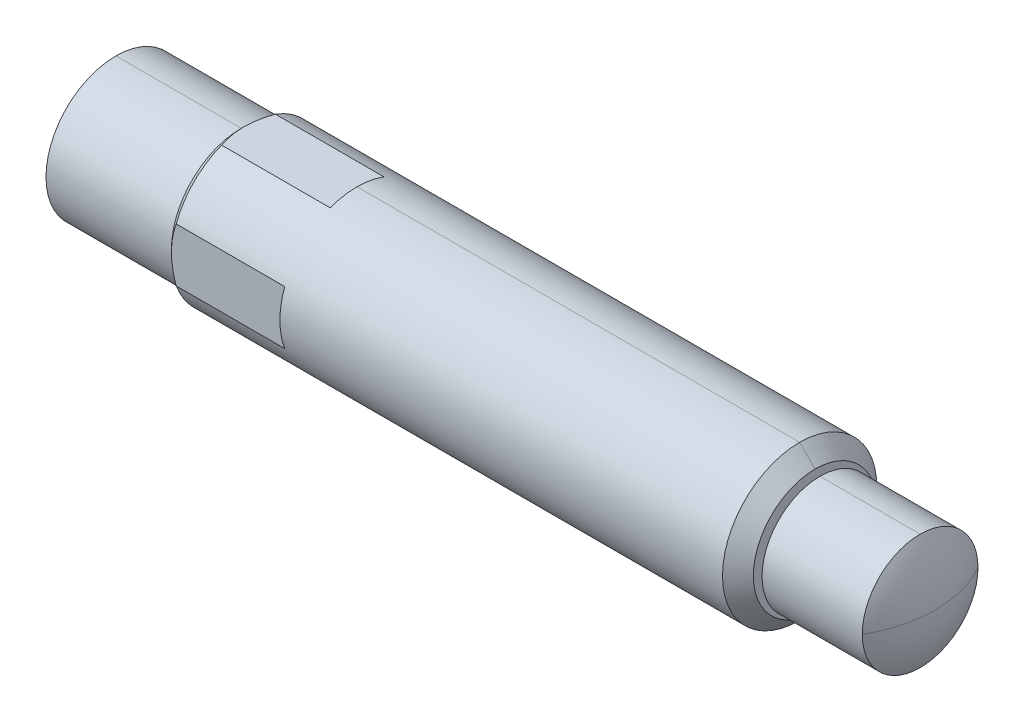
ISO-10303-21;
HEADER;
FILE_DESCRIPTION(('STEP AP214'),'2;1');
FILE_NAME('part.step','',(''),(''),'','','');
FILE_SCHEMA(('AUTOMOTIVE_DESIGN { 1 0 10303 214 1 1 1 1 }'));
ENDSEC;
DATA;
#1=APPLICATION_CONTEXT('core data for automotive mechanical design processes');
#2=APPLICATION_PROTOCOL_DEFINITION('international standard','automotive_design',2000,#1);
#3=PRODUCT_CONTEXT('',#1,'mechanical');
#4=PRODUCT('Part','Part','',(#3));
#5=PRODUCT_RELATED_PRODUCT_CATEGORY('part','',(#4));
#6=PRODUCT_DEFINITION_FORMATION('','',#4);
#7=PRODUCT_DEFINITION_CONTEXT('part definition',#1,'design');
#8=PRODUCT_DEFINITION('design','',#6,#7);
#9=PRODUCT_DEFINITION_SHAPE('','',#8);
#10=(LENGTH_UNIT() NAMED_UNIT(*) SI_UNIT(.MILLI.,.METRE.));
#11=(NAMED_UNIT(*) PLANE_ANGLE_UNIT() SI_UNIT($,.RADIAN.));
#12=(NAMED_UNIT(*) SI_UNIT($,.STERADIAN.) SOLID_ANGLE_UNIT());
#13=UNCERTAINTY_MEASURE_WITH_UNIT(LENGTH_MEASURE(1.E-05),#10,'distance_accuracy_value','');
#14=(GEOMETRIC_REPRESENTATION_CONTEXT(3) GLOBAL_UNCERTAINTY_ASSIGNED_CONTEXT((#13)) GLOBAL_UNIT_ASSIGNED_CONTEXT((#10,
#11,#12)) REPRESENTATION_CONTEXT('',''));
#15=CARTESIAN_POINT('',(0.,0.,0.));
#16=DIRECTION('',(0.,0.,1.));
#17=DIRECTION('',(1.,0.,0.));
#18=AXIS2_PLACEMENT_3D('',#15,#16,#17);
#19=CARTESIAN_POINT('',(0.499999999999972,0.,0.));
#20=DIRECTION('',(1.,0.,0.));
#21=DIRECTION('',(0.,1.,0.));
#22=AXIS2_PLACEMENT_3D('',#19,#20,#21);
#23=SPHERICAL_SURFACE('',#22,12.);
#24=CARTESIAN_POINT('',(10.8923048454133,0.,0.));
#25=DIRECTION('',(1.,0.,0.));
#26=DIRECTION('',(0.,0.,-1.));
#27=AXIS2_PLACEMENT_3D('',#24,#25,#26);
#28=CIRCLE('',#27,6.);
#29=CARTESIAN_POINT('',(10.8923048454133,-6.,0.));
#30=VERTEX_POINT('',#29);
#31=CARTESIAN_POINT('',(10.8923048454133,-5.61562311950955E-12,5.99999999999997));
#32=VERTEX_POINT('',#31);
#33=EDGE_CURVE('E158',#30,#32,#28,.F.);
#34=ORIENTED_EDGE('',*,*,#33,.F.);
#35=CARTESIAN_POINT('',(10.8923048454133,0.,0.));
#36=DIRECTION('',(1.,0.,0.));
#37=DIRECTION('',(0.,0.,-1.));
#38=AXIS2_PLACEMENT_3D('',#35,#36,#37);
#39=CIRCLE('',#38,6.);
#40=CARTESIAN_POINT('',(10.8923048454133,-2.80916782890994E-12,-5.99999999999999));
#41=VERTEX_POINT('',#40);
#42=EDGE_CURVE('E154',#41,#30,#39,.F.);
#43=ORIENTED_EDGE('',*,*,#42,.F.);
#44=CARTESIAN_POINT('',(12.5,0.,0.));
#45=CARTESIAN_POINT('',(12.5000008232801,-2.45104987914039E-13,-0.130899720016836));
#46=CARTESIAN_POINT('',(12.4978581882124,-4.90209888419239E-13,-0.261799393352483));
#47=CARTESIAN_POINT('',(12.4892919112204,-9.80157271765673E-13,-0.52345859437014));
#48=CARTESIAN_POINT('',(12.4828682692961,-1.22499975460691E-12,-0.65421812205215));
#49=CARTESIAN_POINT('',(12.4657458884303,-1.71416005977911E-12,-0.915456979471276));
#50=CARTESIAN_POINT('',(12.4550471494888,-1.95847788211008E-12,-1.04593630920839));
#51=CARTESIAN_POINT('',(12.4293862906439,-2.44632726052987E-12,-1.30647505870105));
#52=CARTESIAN_POINT('',(12.4144241707406,-2.68985881661868E-12,-1.4365344784566));
#53=CARTESIAN_POINT('',(12.3802525022308,-3.17587487860013E-12,-1.69609413482463));
#54=CARTESIAN_POINT('',(12.3610429536244,-3.41835938449278E-12,-1.82559437143711));
#55=CARTESIAN_POINT('',(12.3183970164127,-3.90202168874345E-12,-2.083896990033));
#56=CARTESIAN_POINT('',(12.2949606278074,-4.14319948710147E-12,-2.21269937201641));
#57=CARTESIAN_POINT('',(12.2438861018701,-4.62399011674339E-12,-2.46946835637065));
#58=CARTESIAN_POINT('',(12.2162479645381,-4.86360294802727E-12,-2.59743495874147));
#59=CARTESIAN_POINT('',(12.1567995381179,-5.34100706020427E-12,-2.85239535408346));
#60=CARTESIAN_POINT('',(12.1249892490296,-5.57879834109739E-12,-2.97938914705462));
#61=CARTESIAN_POINT('',(12.057230581908,-6.05230471952642E-12,-3.23226793540585));
#62=CARTESIAN_POINT('',(12.0212822038745,-6.28801981706234E-12,-3.35815293078593));
#63=CARTESIAN_POINT('',(11.9452858536985,-6.75712141946905E-12,-3.60867932332113));
#64=CARTESIAN_POINT('',(11.9052378815558,-6.99050792433984E-12,-3.73332072047625));
#65=CARTESIAN_POINT('',(11.8210852263267,-7.4547024241179E-12,-3.98122644679959));
#66=CARTESIAN_POINT('',(11.7769805432401,-7.68551041902516E-12,-4.10449077596781));
#67=CARTESIAN_POINT('',(11.6847616989357,-8.14430074830473E-12,-4.34951037414175));
#68=CARTESIAN_POINT('',(11.6366475377179,-8.37228308267703E-12,-4.47126564314748));
#69=CARTESIAN_POINT('',(11.536461242553,-8.82517794523351E-12,-4.71313673361463));
#70=CARTESIAN_POINT('',(11.484389108606,-9.05009047341769E-12,-4.83325255507606));
#71=CARTESIAN_POINT('',(11.3763426895022,-9.49660494305538E-12,-5.07171616022937));
#72=CARTESIAN_POINT('',(11.3203684043455,-9.71820688450889E-12,-5.19006394392125));
#73=CARTESIAN_POINT('',(11.204577392439,-1.01578626545307E-11,-5.42486462133473));
#74=CARTESIAN_POINT('',(11.1447606656892,-1.0375916483099E-11,-5.54131751505633));
#75=CARTESIAN_POINT('',(11.0213496786713,-1.08082433854034E-11,-5.77220416876756));
#76=CARTESIAN_POINT('',(10.9577554184032,-1.10225164591396E-11,-5.88663792875718));
#77=CARTESIAN_POINT('',(10.8923048454133,-1.12347828344864E-11,-5.99999999999997));
#78=B_SPLINE_CURVE_WITH_KNOTS('',3,(#44,#45,#46,#47,#48,#49,#50,#51,#52,#53,#54,#55,#56,#57,#58,
#59,#60,#61,#62,#63,#64,#65,#66,#67,#68,#69,#70,#71,#72,#73,#74,#75,#76,#77),.UNSPECIFIED.,.F.,
.F.,(4,2,2,2,2,2,2,2,2,2,2,2,2,2,2,2,4),(0.,0.392681559035681,0.785363118071362,
1.17804467710704,1.57072623614272,1.9634077951784,2.35608935421409,2.74877091324977,
3.14145247228545,3.53413403132113,3.92681559035681,4.31949714939249,4.71217870842817,
5.10486026746385,5.49754182649953,5.89022338553521,6.28290494457089),.UNSPECIFIED.);
#79=CARTESIAN_POINT('',(12.5,0.,0.));
#80=VERTEX_POINT('',#79);
#81=EDGE_CURVE('E176',#80,#41,#78,.T.);
#82=ORIENTED_EDGE('',*,*,#81,.F.);
#83=CARTESIAN_POINT('',(0.499999999999972,0.,0.));
#84=DIRECTION('',(0.,-1.,-1.87199683380525E-12));
#85=DIRECTION('',(1.,0.,0.));
#86=AXIS2_PLACEMENT_3D('',#83,#84,#85);
#87=CIRCLE('',#86,12.);
#88=EDGE_CURVE('E174',#32,#80,#87,.F.);
#89=ORIENTED_EDGE('',*,*,#88,.F.);
#90=EDGE_LOOP('',(#34,#43,#82,#89));
#91=FACE_BOUND('',#90,.T.);
#92=ADVANCED_FACE('F14',(#91),#23,.T.);
#93=CARTESIAN_POINT('',(0.499999999999972,0.,0.));
#94=DIRECTION('',(1.,0.,0.));
#95=DIRECTION('',(0.,1.,0.));
#96=AXIS2_PLACEMENT_3D('',#93,#94,#95);
#97=SPHERICAL_SURFACE('',#96,12.);
#98=CARTESIAN_POINT('',(10.8923048454133,0.,0.));
#99=DIRECTION('',(1.,0.,0.));
#100=DIRECTION('',(0.,0.,-1.));
#101=AXIS2_PLACEMENT_3D('',#98,#99,#100);
#102=CIRCLE('',#101,6.);
#103=CARTESIAN_POINT('',(10.8923048454133,6.,0.));
#104=VERTEX_POINT('',#103);
#105=EDGE_CURVE('E180',#104,#41,#102,.F.);
#106=ORIENTED_EDGE('',*,*,#105,.F.);
#107=CARTESIAN_POINT('',(10.8923048454133,0.,0.));
#108=DIRECTION('',(1.,0.,0.));
#109=DIRECTION('',(0.,0.,-1.));
#110=AXIS2_PLACEMENT_3D('',#107,#108,#109);
#111=CIRCLE('',#110,6.);
#112=EDGE_CURVE('E170',#32,#104,#111,.F.);
#113=ORIENTED_EDGE('',*,*,#112,.F.);
#114=ORIENTED_EDGE('',*,*,#88,.T.);
#115=ORIENTED_EDGE('',*,*,#81,.T.);
#116=EDGE_LOOP('',(#106,#113,#114,#115));
#117=FACE_BOUND('',#116,.T.);
#118=ADVANCED_FACE('F194',(#117),#97,.T.);
#119=CARTESIAN_POINT('',(5.69615242270663,0.,0.));
#120=DIRECTION('',(1.,0.,0.));
#121=DIRECTION('',(0.,0.,-1.));
#122=AXIS2_PLACEMENT_3D('',#119,#120,#121);
#123=CYLINDRICAL_SURFACE('',#122,6.);
#124=DIRECTION('',(1.,0.,0.));
#125=VECTOR('',#124,1.);
#126=CARTESIAN_POINT('',(5.69615242270663,-6.,0.));
#127=LINE('',#126,#125);
#128=CARTESIAN_POINT('',(0.5,-6.,0.));
#129=VERTEX_POINT('',#128);
#130=EDGE_CURVE('E145',#129,#30,#127,.T.);
#131=ORIENTED_EDGE('',*,*,#130,.F.);
#132=CARTESIAN_POINT('',(0.5,0.,0.));
#133=DIRECTION('',(1.,0.,0.));
#134=DIRECTION('',(0.,0.,-1.));
#135=AXIS2_PLACEMENT_3D('',#132,#133,#134);
#136=CIRCLE('',#135,6.);
#137=CARTESIAN_POINT('',(0.5,6.,0.));
#138=VERTEX_POINT('',#137);
#139=EDGE_CURVE('E150',#138,#129,#136,.F.);
#140=ORIENTED_EDGE('',*,*,#139,.F.);
#141=DIRECTION('',(1.,0.,0.));
#142=VECTOR('',#141,1.);
#143=CARTESIAN_POINT('',(5.69615242270663,6.,0.));
#144=LINE('',#143,#142);
#145=EDGE_CURVE('E159',#104,#138,#144,.F.);
#146=ORIENTED_EDGE('',*,*,#145,.F.);
#147=ORIENTED_EDGE('',*,*,#105,.T.);
#148=ORIENTED_EDGE('',*,*,#42,.T.);
#149=EDGE_LOOP('',(#131,#140,#146,#147,#148));
#150=FACE_BOUND('',#149,.T.);
#151=ADVANCED_FACE('F147',(#150),#123,.T.);
#152=CARTESIAN_POINT('',(5.69615242270663,0.,0.));
#153=DIRECTION('',(1.,0.,0.));
#154=DIRECTION('',(0.,0.,-1.));
#155=AXIS2_PLACEMENT_3D('',#152,#153,#154);
#156=CYLINDRICAL_SURFACE('',#155,6.);
#157=ORIENTED_EDGE('',*,*,#33,.T.);
#158=ORIENTED_EDGE('',*,*,#112,.T.);
#159=ORIENTED_EDGE('',*,*,#145,.T.);
#160=CARTESIAN_POINT('',(0.5,0.,0.));
#161=DIRECTION('',(1.,0.,0.));
#162=DIRECTION('',(0.,0.,-1.));
#163=AXIS2_PLACEMENT_3D('',#160,#161,#162);
#164=CIRCLE('',#163,6.);
#165=EDGE_CURVE('E162',#129,#138,#164,.F.);
#166=ORIENTED_EDGE('',*,*,#165,.F.);
#167=ORIENTED_EDGE('',*,*,#130,.T.);
#168=EDGE_LOOP('',(#157,#158,#159,#166,#167));
#169=FACE_BOUND('',#168,.T.);
#170=ADVANCED_FACE('F163',(#169),#156,.T.);
#171=CARTESIAN_POINT('',(0.5,4.5,0.));
#172=DIRECTION('',(-1.,0.,0.));
#173=DIRECTION('',(0.,0.,1.));
#174=AXIS2_PLACEMENT_3D('',#171,#172,#173);
#175=PLANE('',#174);
#176=ORIENTED_EDGE('',*,*,#139,.T.);
#177=ORIENTED_EDGE('',*,*,#165,.T.);
#178=EDGE_LOOP('',(#176,#177));
#179=FACE_BOUND('',#178,.T.);
#180=CARTESIAN_POINT('',(0.5,0.,0.));
#181=DIRECTION('',(1.,0.,0.));
#182=DIRECTION('',(0.,0.,-1.));
#183=AXIS2_PLACEMENT_3D('',#180,#181,#182);
#184=CIRCLE('',#183,3.);
#185=CARTESIAN_POINT('',(0.5,3.,0.));
#186=VERTEX_POINT('',#185);
#187=CARTESIAN_POINT('',(0.5,-3.,0.));
#188=VERTEX_POINT('',#187);
#189=EDGE_CURVE('E235',#186,#188,#184,.F.);
#190=ORIENTED_EDGE('',*,*,#189,.F.);
#191=CARTESIAN_POINT('',(0.5,0.,0.));
#192=DIRECTION('',(1.,0.,0.));
#193=DIRECTION('',(0.,0.,-1.));
#194=AXIS2_PLACEMENT_3D('',#191,#192,#193);
#195=CIRCLE('',#194,3.);
#196=EDGE_CURVE('E231',#188,#186,#195,.F.);
#197=ORIENTED_EDGE('',*,*,#196,.F.);
#198=EDGE_LOOP('',(#190,#197));
#199=FACE_BOUND('',#198,.T.);
#200=ADVANCED_FACE('F168',(#179,#199),#175,.T.);
#201=CARTESIAN_POINT('',(-72.5,3.625,0.));
#202=DIRECTION('',(-1.,0.,0.));
#203=DIRECTION('',(0.,0.,1.));
#204=AXIS2_PLACEMENT_3D('',#201,#202,#203);
#205=PLANE('',#204);
#206=CARTESIAN_POINT('',(-72.5,0.,0.));
#207=DIRECTION('',(1.,0.,0.));
#208=DIRECTION('',(0.,0.,-1.));
#209=AXIS2_PLACEMENT_3D('',#206,#207,#208);
#210=CIRCLE('',#209,7.25);
#211=CARTESIAN_POINT('',(-72.5,-7.25,0.));
#212=VERTEX_POINT('',#211);
#213=CARTESIAN_POINT('',(-72.5,7.25,0.));
#214=VERTEX_POINT('',#213);
#215=EDGE_CURVE('E166',#212,#214,#210,.T.);
#216=ORIENTED_EDGE('',*,*,#215,.F.);
#217=CARTESIAN_POINT('',(-72.5,0.,0.));
#218=DIRECTION('',(1.,0.,0.));
#219=DIRECTION('',(0.,0.,-1.));
#220=AXIS2_PLACEMENT_3D('',#217,#218,#219);
#221=CIRCLE('',#220,7.25);
#222=EDGE_CURVE('E241',#214,#212,#221,.T.);
#223=ORIENTED_EDGE('',*,*,#222,.F.);
#224=EDGE_LOOP('',(#216,#223));
#225=FACE_BOUND('',#224,.T.);
#226=ADVANCED_FACE('F425',(#225),#205,.T.);
#227=CARTESIAN_POINT('',(-66.,0.,0.));
#228=DIRECTION('',(1.,0.,0.));
#229=DIRECTION('',(0.,0.,-1.));
#230=AXIS2_PLACEMENT_3D('',#227,#228,#229);
#231=CYLINDRICAL_SURFACE('',#230,7.25);
#232=DIRECTION('',(1.,0.,0.));
#233=VECTOR('',#232,1.);
#234=CARTESIAN_POINT('',(-66.,-7.25,0.));
#235=LINE('',#234,#233);
#236=CARTESIAN_POINT('',(-59.5,-7.25,0.));
#237=VERTEX_POINT('',#236);
#238=EDGE_CURVE('E244',#212,#237,#235,.T.);
#239=ORIENTED_EDGE('',*,*,#238,.F.);
#240=ORIENTED_EDGE('',*,*,#215,.T.);
#241=DIRECTION('',(1.,0.,0.));
#242=VECTOR('',#241,1.);
#243=CARTESIAN_POINT('',(-66.,7.25,0.));
#244=LINE('',#243,#242);
#245=CARTESIAN_POINT('',(-59.5,7.25,0.));
#246=VERTEX_POINT('',#245);
#247=EDGE_CURVE('E238',#246,#214,#244,.F.);
#248=ORIENTED_EDGE('',*,*,#247,.F.);
#249=CARTESIAN_POINT('',(-59.5,0.,0.));
#250=DIRECTION('',(1.,0.,0.));
#251=DIRECTION('',(0.,1.,0.));
#252=AXIS2_PLACEMENT_3D('',#249,#250,#251);
#253=CIRCLE('',#252,7.25);
#254=EDGE_CURVE('E257',#237,#246,#253,.T.);
#255=ORIENTED_EDGE('',*,*,#254,.F.);
#256=EDGE_LOOP('',(#239,#240,#248,#255));
#257=FACE_BOUND('',#256,.T.);
#258=ADVANCED_FACE('F423',(#257),#231,.T.);
#259=CARTESIAN_POINT('',(0.25,0.,0.));
#260=DIRECTION('',(1.,0.,0.));
#261=DIRECTION('',(0.,0.,-1.));
#262=AXIS2_PLACEMENT_3D('',#259,#260,#261);
#263=CYLINDRICAL_SURFACE('',#262,3.);
#264=DIRECTION('',(1.,0.,0.));
#265=VECTOR('',#264,1.);
#266=CARTESIAN_POINT('',(0.25,-3.,0.));
#267=LINE('',#266,#265);
#268=CARTESIAN_POINT('',(0.,-3.,0.));
#269=VERTEX_POINT('',#268);
#270=EDGE_CURVE('E227',#269,#188,#267,.T.);
#271=ORIENTED_EDGE('',*,*,#270,.F.);
#272=CARTESIAN_POINT('',(0.,0.,0.));
#273=DIRECTION('',(1.,0.,0.));
#274=DIRECTION('',(0.,0.,-1.));
#275=AXIS2_PLACEMENT_3D('',#272,#273,#274);
#276=CIRCLE('',#275,3.);
#277=CARTESIAN_POINT('',(0.,3.,0.));
#278=VERTEX_POINT('',#277);
#279=EDGE_CURVE('E495',#278,#269,#276,.F.);
#280=ORIENTED_EDGE('',*,*,#279,.F.);
#281=DIRECTION('',(1.,0.,0.));
#282=VECTOR('',#281,1.);
#283=CARTESIAN_POINT('',(0.25,3.,0.));
#284=LINE('',#283,#282);
#285=EDGE_CURVE('E232',#186,#278,#284,.F.);
#286=ORIENTED_EDGE('',*,*,#285,.F.);
#287=ORIENTED_EDGE('',*,*,#189,.T.);
#288=EDGE_LOOP('',(#271,#280,#286,#287));
#289=FACE_BOUND('',#288,.T.);
#290=ADVANCED_FACE('F504',(#289),#263,.T.);
#291=CARTESIAN_POINT('',(0.25,0.,0.));
#292=DIRECTION('',(1.,0.,0.));
#293=DIRECTION('',(0.,0.,-1.));
#294=AXIS2_PLACEMENT_3D('',#291,#292,#293);
#295=CYLINDRICAL_SURFACE('',#294,3.);
#296=ORIENTED_EDGE('',*,*,#270,.T.);
#297=ORIENTED_EDGE('',*,*,#196,.T.);
#298=ORIENTED_EDGE('',*,*,#285,.T.);
#299=CARTESIAN_POINT('',(0.,0.,0.));
#300=DIRECTION('',(1.,0.,0.));
#301=DIRECTION('',(0.,0.,-1.));
#302=AXIS2_PLACEMENT_3D('',#299,#300,#301);
#303=CIRCLE('',#302,3.);
#304=EDGE_CURVE('E319',#269,#278,#303,.F.);
#305=ORIENTED_EDGE('',*,*,#304,.F.);
#306=EDGE_LOOP('',(#296,#297,#298,#305));
#307=FACE_BOUND('',#306,.T.);
#308=ADVANCED_FACE('F472',(#307),#295,.T.);
#309=CARTESIAN_POINT('',(-66.,0.,0.));
#310=DIRECTION('',(1.,0.,0.));
#311=DIRECTION('',(0.,0.,-1.));
#312=AXIS2_PLACEMENT_3D('',#309,#310,#311);
#313=CYLINDRICAL_SURFACE('',#312,7.25);
#314=ORIENTED_EDGE('',*,*,#238,.T.);
#315=CARTESIAN_POINT('',(-59.5,0.,0.));
#316=DIRECTION('',(1.,0.,0.));
#317=DIRECTION('',(0.,1.,0.));
#318=AXIS2_PLACEMENT_3D('',#315,#316,#317);
#319=CIRCLE('',#318,7.25);
#320=EDGE_CURVE('E250',#246,#237,#319,.T.);
#321=ORIENTED_EDGE('',*,*,#320,.F.);
#322=ORIENTED_EDGE('',*,*,#247,.T.);
#323=ORIENTED_EDGE('',*,*,#222,.T.);
#324=EDGE_LOOP('',(#314,#321,#322,#323));
#325=FACE_BOUND('',#324,.T.);
#326=ADVANCED_FACE('F428',(#325),#313,.T.);
#327=CARTESIAN_POINT('',(-47.5,0.,0.));
#328=DIRECTION('',(1.,0.,0.));
#329=DIRECTION('',(0.,0.,-1.));
#330=AXIS2_PLACEMENT_3D('',#327,#328,#329);
#331=PLANE('',#330);
#332=DIRECTION('',(0.,1.,0.));
#333=VECTOR('',#332,1.);
#334=CARTESIAN_POINT('',(-47.5,7.5,-7.5));
#335=LINE('',#334,#333);
#336=CARTESIAN_POINT('',(-47.5,-2.78388218141501,-7.5));
#337=VERTEX_POINT('',#336);
#338=CARTESIAN_POINT('',(-47.5,2.78388218141501,-7.5));
#339=VERTEX_POINT('',#338);
#340=EDGE_CURVE('E247',#337,#339,#335,.T.);
#341=ORIENTED_EDGE('',*,*,#340,.T.);
#342=CARTESIAN_POINT('',(-47.5,0.,0.));
#343=DIRECTION('',(1.,0.,0.));
#344=DIRECTION('',(0.,0.,-1.));
#345=AXIS2_PLACEMENT_3D('',#342,#343,#344);
#346=CIRCLE('',#345,8.);
#347=EDGE_CURVE('E282',#337,#339,#346,.T.);
#348=ORIENTED_EDGE('',*,*,#347,.F.);
#349=EDGE_LOOP('',(#341,#348));
#350=FACE_BOUND('',#349,.T.);
#351=ADVANCED_FACE('F465',(#350),#331,.F.);
#352=CARTESIAN_POINT('',(-47.5,7.5,-7.5));
#353=DIRECTION('',(0.,0.,1.));
#354=DIRECTION('',(1.,0.,0.));
#355=AXIS2_PLACEMENT_3D('',#352,#353,#354);
#356=PLANE('',#355);
#357=CARTESIAN_POINT('',(-58.75,2.78388218141501,-7.5));
#358=CARTESIAN_POINT('',(-58.7908343610241,2.6665325399711,-7.5));
#359=CARTESIAN_POINT('',(-58.8296450609404,2.54848292274457,-7.5));
#360=CARTESIAN_POINT('',(-58.9028438594073,2.31098265055368,-7.5));
#361=CARTESIAN_POINT('',(-58.9372305831194,2.19153157258164,-7.5));
#362=CARTESIAN_POINT('',(-59.0332630346701,1.83077940481886,-7.5));
#363=CARTESIAN_POINT('',(-59.0876406905147,1.58747536783262,-7.5));
#364=CARTESIAN_POINT('',(-59.1726854727309,1.10468346411936,-7.5));
#365=CARTESIAN_POINT('',(-59.2040501641788,0.8653194538993,-7.5));
#366=CARTESIAN_POINT('',(-59.2439382841863,0.384901302167785,-7.5));
#367=CARTESIAN_POINT('',(-59.2524857448856,0.143849207225305,-7.5));
#368=CARTESIAN_POINT('',(-59.2464610472351,-0.32227682020807,-7.5));
#369=CARTESIAN_POINT('',(-59.2333546401303,-0.547371523456219,-7.5));
#370=CARTESIAN_POINT('',(-59.1874824156523,-0.995727692119136,-7.5));
#371=CARTESIAN_POINT('',(-59.1546992438144,-1.21898736266478,-7.5));
#372=CARTESIAN_POINT('',(-59.0698469306853,-1.66883770237948,-7.5));
#373=CARTESIAN_POINT('',(-59.0172170392475,-1.89532047216224,-7.5));
#374=CARTESIAN_POINT('',(-58.895398818921,-2.34337550813609,-7.5));
#375=CARTESIAN_POINT('',(-58.8262406355852,-2.56495592093498,-7.5));
#376=CARTESIAN_POINT('',(-58.75,-2.78388218141501,-7.5));
#377=B_SPLINE_CURVE_WITH_KNOTS('',3,(#357,#358,#359,#360,#361,#362,#363,#364,#365,#366,#367,
#368,#369,#370,#371,#372,#373,#374,#375,#376),.UNSPECIFIED.,.F.,.F.,(4,2,2,2,2,2,2,2,2,4),(0.,
0.372720020709469,0.745555593197198,1.49248371390584,2.21571265277952,2.93817955310983,
3.61371600872445,4.28984914964184,4.98672269593563,5.68233480290052),.UNSPECIFIED.);
#378=CARTESIAN_POINT('',(-58.75,2.78388218141501,-7.5));
#379=VERTEX_POINT('',#378);
#380=CARTESIAN_POINT('',(-58.75,-2.78388218141501,-7.5));
#381=VERTEX_POINT('',#380);
#382=EDGE_CURVE('E261',#379,#381,#377,.T.);
#383=ORIENTED_EDGE('',*,*,#382,.F.);
#384=DIRECTION('',(1.,0.,0.));
#385=VECTOR('',#384,1.);
#386=CARTESIAN_POINT('',(-30.175,2.78388218141501,-7.5));
#387=LINE('',#386,#385);
#388=EDGE_CURVE('E284',#339,#379,#387,.F.);
#389=ORIENTED_EDGE('',*,*,#388,.F.);
#390=ORIENTED_EDGE('',*,*,#340,.F.);
#391=DIRECTION('',(1.,0.,0.));
#392=VECTOR('',#391,1.);
#393=CARTESIAN_POINT('',(-30.175,-2.78388218141501,-7.5));
#394=LINE('',#393,#392);
#395=EDGE_CURVE('E279',#381,#337,#394,.T.);
#396=ORIENTED_EDGE('',*,*,#395,.F.);
#397=EDGE_LOOP('',(#383,#389,#390,#396));
#398=FACE_BOUND('',#397,.T.);
#399=ADVANCED_FACE('F403',(#398),#356,.F.);
#400=CARTESIAN_POINT('',(-58.75,0.,0.));
#401=DIRECTION('',(1.,0.,0.));
#402=DIRECTION('',(0.,0.,-1.));
#403=AXIS2_PLACEMENT_3D('',#400,#401,#402);
#404=CONICAL_SURFACE('',#403,8.,0.785398163397448);
#405=DIRECTION('',(-0.707106781186548,0.707106781186548,0.));
#406=VECTOR('',#405,1.);
#407=CARTESIAN_POINT('',(-59.125,-7.625,0.));
#408=LINE('',#407,#406);
#409=CARTESIAN_POINT('',(-59.25,-7.5,0.));
#410=VERTEX_POINT('',#409);
#411=EDGE_CURVE('E253',#237,#410,#408,.F.);
#412=ORIENTED_EDGE('',*,*,#411,.F.);
#413=ORIENTED_EDGE('',*,*,#254,.T.);
#414=DIRECTION('',(-0.707106781186548,-0.707106781186548,0.));
#415=VECTOR('',#414,1.);
#416=CARTESIAN_POINT('',(-59.125,7.625,0.));
#417=LINE('',#416,#415);
#418=CARTESIAN_POINT('',(-59.25,7.5,0.));
#419=VERTEX_POINT('',#418);
#420=EDGE_CURVE('E254',#419,#246,#417,.T.);
#421=ORIENTED_EDGE('',*,*,#420,.F.);
#422=CARTESIAN_POINT('',(-59.25,7.5,0.));
#423=CARTESIAN_POINT('',(-59.2500151134973,7.5,-0.118906126701689));
#424=CARTESIAN_POINT('',(-59.24717265383,7.5,-0.237806754451902));
#425=CARTESIAN_POINT('',(-59.2358850873229,7.5,-0.475323545770295));
#426=CARTESIAN_POINT('',(-59.2274408742413,7.5,-0.593939751688444));
#427=CARTESIAN_POINT('',(-59.2051412959235,7.5,-0.829816038019026));
#428=CARTESIAN_POINT('',(-59.1913245868226,7.5,-0.947079778541001));
#429=CARTESIAN_POINT('',(-59.1584887421915,7.5,-1.18086668836219));
#430=CARTESIAN_POINT('',(-59.1394695468033,7.5,-1.29738984912476));
#431=CARTESIAN_POINT('',(-59.0750146702574,7.5,-1.64537755437254));
#432=CARTESIAN_POINT('',(-59.0221571948173,7.5,-1.87550968066489));
#433=CARTESIAN_POINT('',(-58.9297091014408,7.5,-2.21792547883431));
#434=CARTESIAN_POINT('',(-58.8965514582847,7.5,-2.33201886163555));
#435=CARTESIAN_POINT('',(-58.8262112413854,7.5,-2.55891324258524));
#436=CARTESIAN_POINT('',(-58.7890301792891,7.5,-2.67171470862875));
#437=CARTESIAN_POINT('',(-58.75,7.5,-2.78388218141501));
#438=B_SPLINE_CURVE_WITH_KNOTS('',3,(#422,#423,#424,#425,#426,#427,#428,#429,#430,#431,#432,
#433,#434,#435,#436,#437),.UNSPECIFIED.,.F.,.F.,(4,2,2,2,2,2,2,4),(0.,0.356675243165351,
0.713293592586999,1.06739212005566,1.42149472183134,2.1289507330168,2.48533609962451,
2.84158802983759),.UNSPECIFIED.);
#439=CARTESIAN_POINT('',(-58.75,7.5,-2.78388218141501));
#440=VERTEX_POINT('',#439);
#441=EDGE_CURVE('E318',#419,#440,#438,.T.);
#442=ORIENTED_EDGE('',*,*,#441,.T.);
#443=CARTESIAN_POINT('',(-58.75,0.,0.));
#444=DIRECTION('',(1.,0.,0.));
#445=DIRECTION('',(0.,0.,-1.));
#446=AXIS2_PLACEMENT_3D('',#443,#444,#445);
#447=CIRCLE('',#446,8.);
#448=EDGE_CURVE('E287',#379,#440,#447,.T.);
#449=ORIENTED_EDGE('',*,*,#448,.F.);
#450=ORIENTED_EDGE('',*,*,#382,.T.);
#451=CARTESIAN_POINT('',(-58.75,0.,0.));
#452=DIRECTION('',(1.,0.,0.));
#453=DIRECTION('',(0.,0.,-1.));
#454=AXIS2_PLACEMENT_3D('',#451,#452,#453);
#455=CIRCLE('',#454,8.);
#456=CARTESIAN_POINT('',(-58.75,-7.5,-2.78388218141501));
#457=VERTEX_POINT('',#456);
#458=EDGE_CURVE('E275',#457,#381,#455,.T.);
#459=ORIENTED_EDGE('',*,*,#458,.F.);
#460=CARTESIAN_POINT('',(-58.75,-7.5,-2.78388218141501));
#461=CARTESIAN_POINT('',(-58.7890301792891,-7.5,-2.67171470862875));
#462=CARTESIAN_POINT('',(-58.8262112413855,-7.5,-2.55891324258524));
#463=CARTESIAN_POINT('',(-58.8965514582847,-7.5,-2.33201886163555));
#464=CARTESIAN_POINT('',(-58.9297091014408,-7.5,-2.21792547883431));
#465=CARTESIAN_POINT('',(-59.0221571948173,-7.5,-1.87550968066489));
#466=CARTESIAN_POINT('',(-59.0750146702574,-7.5,-1.64537755437254));
#467=CARTESIAN_POINT('',(-59.1394695468033,-7.5,-1.29738984912476));
#468=CARTESIAN_POINT('',(-59.1584887421915,-7.5,-1.18086668836219));
#469=CARTESIAN_POINT('',(-59.1913245868226,-7.5,-0.947079778541001));
#470=CARTESIAN_POINT('',(-59.2051412959235,-7.5,-0.829816038019026));
#471=CARTESIAN_POINT('',(-59.2274408742413,-7.5,-0.593939751688444));
#472=CARTESIAN_POINT('',(-59.2358850873229,-7.5,-0.475323545770295));
#473=CARTESIAN_POINT('',(-59.24717265383,-7.5,-0.237806754451902));
#474=CARTESIAN_POINT('',(-59.2500151134973,-7.5,-0.118906126701688));
#475=CARTESIAN_POINT('',(-59.25,-7.5,0.));
#476=B_SPLINE_CURVE_WITH_KNOTS('',3,(#460,#461,#462,#463,#464,#465,#466,#467,#468,#469,#470,
#471,#472,#473,#474,#475),.UNSPECIFIED.,.F.,.F.,(4,2,2,2,2,2,2,4),(0.,0.356251930213089,
0.712637296820797,1.42009330800625,1.77419590978193,2.12829443725059,2.48491278667224,
2.84158802983759),.UNSPECIFIED.);
#477=EDGE_CURVE('E349',#457,#410,#476,.T.);
#478=ORIENTED_EDGE('',*,*,#477,.T.);
#479=EDGE_LOOP('',(#412,#413,#421,#442,#449,#450,#459,#478));
#480=FACE_BOUND('',#479,.T.);
#481=ADVANCED_FACE('F397',(#480),#404,.T.);
#482=CARTESIAN_POINT('',(-1.59999999999999,0.,0.));
#483=DIRECTION('',(-1.,0.,0.));
#484=DIRECTION('',(0.,0.,1.));
#485=AXIS2_PLACEMENT_3D('',#482,#483,#484);
#486=CONICAL_SURFACE('',#485,8.,0.78539816339745);
#487=DIRECTION('',(0.707106781186546,0.707106781186549,0.));
#488=VECTOR('',#487,1.);
#489=CARTESIAN_POINT('',(-0.799999999999997,-7.2,0.));
#490=LINE('',#489,#488);
#491=CARTESIAN_POINT('',(-1.59999999999999,-8.,0.));
#492=VERTEX_POINT('',#491);
#493=CARTESIAN_POINT('',(0.,-6.4,0.));
#494=VERTEX_POINT('',#493);
#495=EDGE_CURVE('E34',#492,#494,#490,.T.);
#496=ORIENTED_EDGE('',*,*,#495,.F.);
#497=CARTESIAN_POINT('',(-1.59999999999999,0.,0.));
#498=DIRECTION('',(1.,0.,0.));
#499=DIRECTION('',(0.,0.,-1.));
#500=AXIS2_PLACEMENT_3D('',#497,#498,#499);
#501=CIRCLE('',#500,8.);
#502=CARTESIAN_POINT('',(-1.59999999999999,8.,0.));
#503=VERTEX_POINT('',#502);
#504=EDGE_CURVE('E307',#503,#492,#501,.F.);
#505=ORIENTED_EDGE('',*,*,#504,.F.);
#506=DIRECTION('',(0.707106781186546,-0.707106781186549,0.));
#507=VECTOR('',#506,1.);
#508=CARTESIAN_POINT('',(-0.799999999999997,7.2,0.));
#509=LINE('',#508,#507);
#510=CARTESIAN_POINT('',(0.,6.4,0.));
#511=VERTEX_POINT('',#510);
#512=EDGE_CURVE('E298',#511,#503,#509,.F.);
#513=ORIENTED_EDGE('',*,*,#512,.F.);
#514=CARTESIAN_POINT('',(0.,0.,0.));
#515=DIRECTION('',(-1.,0.,0.));
#516=DIRECTION('',(0.,0.,1.));
#517=AXIS2_PLACEMENT_3D('',#514,#515,#516);
#518=CIRCLE('',#517,6.4);
#519=EDGE_CURVE('E260',#494,#511,#518,.F.);
#520=ORIENTED_EDGE('',*,*,#519,.F.);
#521=EDGE_LOOP('',(#496,#505,#513,#520));
#522=FACE_BOUND('',#521,.T.);
#523=ADVANCED_FACE('F402',(#522),#486,.T.);
#524=CARTESIAN_POINT('',(0.,4.7,0.));
#525=DIRECTION('',(1.,0.,0.));
#526=DIRECTION('',(0.,1.,0.));
#527=AXIS2_PLACEMENT_3D('',#524,#525,#526);
#528=PLANE('',#527);
#529=ORIENTED_EDGE('',*,*,#279,.T.);
#530=ORIENTED_EDGE('',*,*,#304,.T.);
#531=EDGE_LOOP('',(#529,#530));
#532=FACE_BOUND('',#531,.T.);
#533=ORIENTED_EDGE('',*,*,#519,.T.);
#534=CARTESIAN_POINT('',(0.,0.,0.));
#535=DIRECTION('',(-1.,0.,0.));
#536=DIRECTION('',(0.,0.,1.));
#537=AXIS2_PLACEMENT_3D('',#534,#535,#536);
#538=CIRCLE('',#537,6.4);
#539=EDGE_CURVE('E297',#494,#511,#538,.T.);
#540=ORIENTED_EDGE('',*,*,#539,.F.);
#541=EDGE_LOOP('',(#533,#540));
#542=FACE_BOUND('',#541,.T.);
#543=ADVANCED_FACE('F494',(#532,#542),#528,.T.);
#544=CARTESIAN_POINT('',(-47.5,0.,0.));
#545=DIRECTION('',(1.,0.,0.));
#546=DIRECTION('',(0.,0.,-1.));
#547=AXIS2_PLACEMENT_3D('',#544,#545,#546);
#548=PLANE('',#547);
#549=DIRECTION('',(0.,0.,-1.));
#550=VECTOR('',#549,1.);
#551=CARTESIAN_POINT('',(-47.5,7.5,6.79289321881345));
#552=LINE('',#551,#550);
#553=CARTESIAN_POINT('',(-47.5,7.5,-2.78388218141501));
#554=VERTEX_POINT('',#553);
#555=CARTESIAN_POINT('',(-47.5,7.5,2.78388218141501));
#556=VERTEX_POINT('',#555);
#557=EDGE_CURVE('E316',#554,#556,#552,.F.);
#558=ORIENTED_EDGE('',*,*,#557,.T.);
#559=CARTESIAN_POINT('',(-47.5,0.,0.));
#560=DIRECTION('',(1.,0.,0.));
#561=DIRECTION('',(0.,0.,-1.));
#562=AXIS2_PLACEMENT_3D('',#559,#560,#561);
#563=CIRCLE('',#562,8.);
#564=CARTESIAN_POINT('',(-47.5,8.,0.));
#565=VERTEX_POINT('',#564);
#566=EDGE_CURVE('E315',#565,#556,#563,.T.);
#567=ORIENTED_EDGE('',*,*,#566,.F.);
#568=CARTESIAN_POINT('',(-47.5,0.,0.));
#569=DIRECTION('',(1.,0.,0.));
#570=DIRECTION('',(0.,0.,-1.));
#571=AXIS2_PLACEMENT_3D('',#568,#569,#570);
#572=CIRCLE('',#571,8.);
#573=EDGE_CURVE('E293',#554,#565,#572,.T.);
#574=ORIENTED_EDGE('',*,*,#573,.F.);
#575=EDGE_LOOP('',(#558,#567,#574));
#576=FACE_BOUND('',#575,.T.);
#577=ADVANCED_FACE('F563',(#576),#548,.F.);
#578=CARTESIAN_POINT('',(-47.5,7.5,6.79289321881345));
#579=DIRECTION('',(0.,-1.,0.));
#580=DIRECTION('',(0.,0.,-1.));
#581=AXIS2_PLACEMENT_3D('',#578,#579,#580);
#582=PLANE('',#581);
#583=ORIENTED_EDGE('',*,*,#441,.F.);
#584=CARTESIAN_POINT('',(-58.75,7.5,2.78388218141501));
#585=CARTESIAN_POINT('',(-58.7890301792891,7.5,2.67171470862875));
#586=CARTESIAN_POINT('',(-58.8262112413855,7.5,2.55891324258524));
#587=CARTESIAN_POINT('',(-58.8965514582847,7.5,2.33201886163555));
#588=CARTESIAN_POINT('',(-58.9297091014408,7.5,2.21792547883431));
#589=CARTESIAN_POINT('',(-59.0221571948173,7.5,1.87550968066489));
#590=CARTESIAN_POINT('',(-59.0750146702574,7.5,1.64537755437254));
#591=CARTESIAN_POINT('',(-59.1394695468033,7.5,1.29738984912476));
#592=CARTESIAN_POINT('',(-59.1584887421915,7.5,1.18086668836219));
#593=CARTESIAN_POINT('',(-59.1913245868226,7.5,0.947079778541001));
#594=CARTESIAN_POINT('',(-59.2051412959235,7.5,0.829816038019026));
#595=CARTESIAN_POINT('',(-59.2274408742413,7.5,0.593939751688444));
#596=CARTESIAN_POINT('',(-59.2358850873229,7.5,0.475323545770295));
#597=CARTESIAN_POINT('',(-59.24717265383,7.5,0.237806754451902));
#598=CARTESIAN_POINT('',(-59.2500151134973,7.5,0.118906126701688));
#599=CARTESIAN_POINT('',(-59.25,7.5,0.));
#600=B_SPLINE_CURVE_WITH_KNOTS('',3,(#584,#585,#586,#587,#588,#589,#590,#591,#592,#593,#594,
#595,#596,#597,#598,#599),.UNSPECIFIED.,.F.,.F.,(4,2,2,2,2,2,2,4),(0.,0.356251930213089,
0.712637296820797,1.42009330800625,1.77419590978193,2.12829443725059,2.48491278667224,
2.84158802983759),.UNSPECIFIED.);
#601=CARTESIAN_POINT('',(-58.75,7.5,2.78388218141501));
#602=VERTEX_POINT('',#601);
#603=EDGE_CURVE('E354',#602,#419,#600,.T.);
#604=ORIENTED_EDGE('',*,*,#603,.F.);
#605=DIRECTION('',(1.,0.,0.));
#606=VECTOR('',#605,1.);
#607=CARTESIAN_POINT('',(-30.175,7.5,2.78388218141501));
#608=LINE('',#607,#606);
#609=EDGE_CURVE('E320',#556,#602,#608,.F.);
#610=ORIENTED_EDGE('',*,*,#609,.F.);
#611=ORIENTED_EDGE('',*,*,#557,.F.);
#612=DIRECTION('',(1.,0.,0.));
#613=VECTOR('',#612,1.);
#614=CARTESIAN_POINT('',(-30.175,7.5,-2.78388218141501));
#615=LINE('',#614,#613);
#616=EDGE_CURVE('E290',#440,#554,#615,.T.);
#617=ORIENTED_EDGE('',*,*,#616,.F.);
#618=EDGE_LOOP('',(#583,#604,#610,#611,#617));
#619=FACE_BOUND('',#618,.T.);
#620=ADVANCED_FACE('F394',(#619),#582,.F.);
#621=CARTESIAN_POINT('',(-47.5,0.,0.));
#622=DIRECTION('',(1.,0.,0.));
#623=DIRECTION('',(0.,0.,-1.));
#624=AXIS2_PLACEMENT_3D('',#621,#622,#623);
#625=PLANE('',#624);
#626=DIRECTION('',(0.,1.,0.));
#627=VECTOR('',#626,1.);
#628=CARTESIAN_POINT('',(-47.5,-7.5,7.5));
#629=LINE('',#628,#627);
#630=CARTESIAN_POINT('',(-47.5,2.78388218141501,7.5));
#631=VERTEX_POINT('',#630);
#632=CARTESIAN_POINT('',(-47.5,-2.78388218141501,7.5));
#633=VERTEX_POINT('',#632);
#634=EDGE_CURVE('E266',#631,#633,#629,.F.);
#635=ORIENTED_EDGE('',*,*,#634,.T.);
#636=CARTESIAN_POINT('',(-47.5,0.,0.));
#637=DIRECTION('',(1.,0.,0.));
#638=DIRECTION('',(0.,0.,-1.));
#639=AXIS2_PLACEMENT_3D('',#636,#637,#638);
#640=CIRCLE('',#639,8.);
#641=EDGE_CURVE('E329',#631,#633,#640,.T.);
#642=ORIENTED_EDGE('',*,*,#641,.F.);
#643=EDGE_LOOP('',(#635,#642));
#644=FACE_BOUND('',#643,.T.);
#645=ADVANCED_FACE('F578',(#644),#625,.F.);
#646=CARTESIAN_POINT('',(-47.5,-7.5,7.5));
#647=DIRECTION('',(0.,0.,-1.));
#648=DIRECTION('',(-1.,0.,0.));
#649=AXIS2_PLACEMENT_3D('',#646,#647,#648);
#650=PLANE('',#649);
#651=CARTESIAN_POINT('',(-58.75,-2.78388218141501,7.5));
#652=CARTESIAN_POINT('',(-58.7908343610241,-2.6665325399711,7.5));
#653=CARTESIAN_POINT('',(-58.8296450609404,-2.54848292274457,7.5));
#654=CARTESIAN_POINT('',(-58.9028438594073,-2.31098265055367,7.5));
#655=CARTESIAN_POINT('',(-58.9372305831194,-2.19153157258164,7.5));
#656=CARTESIAN_POINT('',(-59.0332630346701,-1.83077940481886,7.5));
#657=CARTESIAN_POINT('',(-59.0876406905147,-1.58747536783262,7.5));
#658=CARTESIAN_POINT('',(-59.1726854727309,-1.10468346411936,7.5));
#659=CARTESIAN_POINT('',(-59.2040501641788,-0.8653194538993,7.5));
#660=CARTESIAN_POINT('',(-59.2439382841863,-0.384901302167785,7.5));
#661=CARTESIAN_POINT('',(-59.2524857448856,-0.143849207225305,7.5));
#662=CARTESIAN_POINT('',(-59.2464610472351,0.322276820208069,7.5));
#663=CARTESIAN_POINT('',(-59.2333546401303,0.547371523456219,7.5));
#664=CARTESIAN_POINT('',(-59.1874824156523,0.995727692119135,7.5));
#665=CARTESIAN_POINT('',(-59.1546992438144,1.21898736266478,7.5));
#666=CARTESIAN_POINT('',(-59.0698469306853,1.66883770237948,7.5));
#667=CARTESIAN_POINT('',(-59.0172170392475,1.89532047216224,7.5));
#668=CARTESIAN_POINT('',(-58.895398818921,2.34337550813609,7.5));
#669=CARTESIAN_POINT('',(-58.8262406355852,2.56495592093498,7.5));
#670=CARTESIAN_POINT('',(-58.75,2.78388218141501,7.5));
#671=B_SPLINE_CURVE_WITH_KNOTS('',3,(#651,#652,#653,#654,#655,#656,#657,#658,#659,#660,#661,
#662,#663,#664,#665,#666,#667,#668,#669,#670),.UNSPECIFIED.,.F.,.F.,(4,2,2,2,2,2,2,2,2,4),(0.,
0.372720020709471,0.7455555931972,1.49248371390584,2.21571265277952,2.93817955310982,
3.61371600872445,4.28984914964184,4.98672269593562,5.68233480290052),.UNSPECIFIED.);
#672=CARTESIAN_POINT('',(-58.75,-2.78388218141501,7.5));
#673=VERTEX_POINT('',#672);
#674=CARTESIAN_POINT('',(-58.75,2.78388218141501,7.5));
#675=VERTEX_POINT('',#674);
#676=EDGE_CURVE('E271',#673,#675,#671,.T.);
#677=ORIENTED_EDGE('',*,*,#676,.F.);
#678=DIRECTION('',(1.,0.,0.));
#679=VECTOR('',#678,1.);
#680=CARTESIAN_POINT('',(-30.175,-2.78388218141501,7.5));
#681=LINE('',#680,#679);
#682=EDGE_CURVE('E331',#633,#673,#681,.F.);
#683=ORIENTED_EDGE('',*,*,#682,.F.);
#684=ORIENTED_EDGE('',*,*,#634,.F.);
#685=DIRECTION('',(1.,0.,0.));
#686=VECTOR('',#685,1.);
#687=CARTESIAN_POINT('',(-30.175,2.78388218141501,7.5));
#688=LINE('',#687,#686);
#689=EDGE_CURVE('E326',#675,#631,#688,.T.);
#690=ORIENTED_EDGE('',*,*,#689,.F.);
#691=EDGE_LOOP('',(#677,#683,#684,#690));
#692=FACE_BOUND('',#691,.T.);
#693=ADVANCED_FACE('F375',(#692),#650,.F.);
#694=CARTESIAN_POINT('',(-58.75,0.,0.));
#695=DIRECTION('',(1.,0.,0.));
#696=DIRECTION('',(0.,0.,-1.));
#697=AXIS2_PLACEMENT_3D('',#694,#695,#696);
#698=CONICAL_SURFACE('',#697,8.,0.785398163397448);
#699=CARTESIAN_POINT('',(-58.75,0.,0.));
#700=DIRECTION('',(1.,0.,0.));
#701=DIRECTION('',(0.,0.,-1.));
#702=AXIS2_PLACEMENT_3D('',#699,#700,#701);
#703=CIRCLE('',#702,8.);
#704=EDGE_CURVE('E323',#602,#675,#703,.T.);
#705=ORIENTED_EDGE('',*,*,#704,.F.);
#706=ORIENTED_EDGE('',*,*,#603,.T.);
#707=ORIENTED_EDGE('',*,*,#420,.T.);
#708=ORIENTED_EDGE('',*,*,#320,.T.);
#709=ORIENTED_EDGE('',*,*,#411,.T.);
#710=CARTESIAN_POINT('',(-59.25,-7.5,0.));
#711=CARTESIAN_POINT('',(-59.2500151134973,-7.5,0.118906126701689));
#712=CARTESIAN_POINT('',(-59.24717265383,-7.5,0.237806754451903));
#713=CARTESIAN_POINT('',(-59.2358850873229,-7.5,0.475323545770296));
#714=CARTESIAN_POINT('',(-59.2274408742413,-7.5,0.593939751688444));
#715=CARTESIAN_POINT('',(-59.2051412959235,-7.5,0.829816038019025));
#716=CARTESIAN_POINT('',(-59.1913245868226,-7.5,0.947079778541));
#717=CARTESIAN_POINT('',(-59.1584887421915,-7.5,1.18086668836219));
#718=CARTESIAN_POINT('',(-59.1394695468033,-7.5,1.29738984912476));
#719=CARTESIAN_POINT('',(-59.0750146702574,-7.5,1.64537755437254));
#720=CARTESIAN_POINT('',(-59.0221571948173,-7.5,1.87550968066489));
#721=CARTESIAN_POINT('',(-58.9297091014408,-7.5,2.21792547883431));
#722=CARTESIAN_POINT('',(-58.8965514582847,-7.5,2.33201886163555));
#723=CARTESIAN_POINT('',(-58.8262112413854,-7.5,2.55891324258524));
#724=CARTESIAN_POINT('',(-58.7890301792891,-7.5,2.67171470862875));
#725=CARTESIAN_POINT('',(-58.75,-7.5,2.78388218141501));
#726=B_SPLINE_CURVE_WITH_KNOTS('',3,(#710,#711,#712,#713,#714,#715,#716,#717,#718,#719,#720,
#721,#722,#723,#724,#725),.UNSPECIFIED.,.F.,.F.,(4,2,2,2,2,2,2,4),(0.,0.356675243165351,
0.713293592586999,1.06739212005566,1.42149472183134,2.1289507330168,2.48533609962451,
2.84158802983759),.UNSPECIFIED.);
#727=CARTESIAN_POINT('',(-58.75,-7.5,2.78388218141501));
#728=VERTEX_POINT('',#727);
#729=EDGE_CURVE('E344',#410,#728,#726,.T.);
#730=ORIENTED_EDGE('',*,*,#729,.T.);
#731=CARTESIAN_POINT('',(-58.75,0.,0.));
#732=DIRECTION('',(1.,0.,0.));
#733=DIRECTION('',(0.,0.,-1.));
#734=AXIS2_PLACEMENT_3D('',#731,#732,#733);
#735=CIRCLE('',#734,8.);
#736=EDGE_CURVE('E334',#673,#728,#735,.T.);
#737=ORIENTED_EDGE('',*,*,#736,.F.);
#738=ORIENTED_EDGE('',*,*,#676,.T.);
#739=EDGE_LOOP('',(#705,#706,#707,#708,#709,#730,#737,#738));
#740=FACE_BOUND('',#739,.T.);
#741=ADVANCED_FACE('F371',(#740),#698,.T.);
#742=CARTESIAN_POINT('',(-47.5,-7.5,-7.5));
#743=DIRECTION('',(0.,1.,0.));
#744=DIRECTION('',(0.,0.,1.));
#745=AXIS2_PLACEMENT_3D('',#742,#743,#744);
#746=PLANE('',#745);
#747=DIRECTION('',(0.,0.,-1.));
#748=VECTOR('',#747,1.);
#749=CARTESIAN_POINT('',(-47.5,-7.5,0.));
#750=LINE('',#749,#748);
#751=CARTESIAN_POINT('',(-47.5,-7.5,-2.78388218141501));
#752=VERTEX_POINT('',#751);
#753=CARTESIAN_POINT('',(-47.5,-7.5,2.78388218141501));
#754=VERTEX_POINT('',#753);
#755=EDGE_CURVE('E309',#752,#754,#750,.F.);
#756=ORIENTED_EDGE('',*,*,#755,.T.);
#757=DIRECTION('',(1.,0.,0.));
#758=VECTOR('',#757,1.);
#759=CARTESIAN_POINT('',(-30.175,-7.5,2.78388218141501));
#760=LINE('',#759,#758);
#761=EDGE_CURVE('E337',#728,#754,#760,.T.);
#762=ORIENTED_EDGE('',*,*,#761,.F.);
#763=ORIENTED_EDGE('',*,*,#729,.F.);
#764=ORIENTED_EDGE('',*,*,#477,.F.);
#765=DIRECTION('',(1.,0.,0.));
#766=VECTOR('',#765,1.);
#767=CARTESIAN_POINT('',(-30.175,-7.5,-2.78388218141501));
#768=LINE('',#767,#766);
#769=EDGE_CURVE('E272',#752,#457,#768,.F.);
#770=ORIENTED_EDGE('',*,*,#769,.F.);
#771=EDGE_LOOP('',(#756,#762,#763,#764,#770));
#772=FACE_BOUND('',#771,.T.);
#773=ADVANCED_FACE('F368',(#772),#746,.F.);
#774=CARTESIAN_POINT('',(-47.5,0.,0.));
#775=DIRECTION('',(1.,0.,0.));
#776=DIRECTION('',(0.,0.,-1.));
#777=AXIS2_PLACEMENT_3D('',#774,#775,#776);
#778=PLANE('',#777);
#779=ORIENTED_EDGE('',*,*,#755,.F.);
#780=CARTESIAN_POINT('',(-47.5,0.,0.));
#781=DIRECTION('',(1.,0.,0.));
#782=DIRECTION('',(0.,0.,-1.));
#783=AXIS2_PLACEMENT_3D('',#780,#781,#782);
#784=CIRCLE('',#783,8.);
#785=CARTESIAN_POINT('',(-47.5,-8.,0.));
#786=VERTEX_POINT('',#785);
#787=EDGE_CURVE('E276',#786,#752,#784,.T.);
#788=ORIENTED_EDGE('',*,*,#787,.F.);
#789=CARTESIAN_POINT('',(-47.5,0.,0.));
#790=DIRECTION('',(1.,0.,0.));
#791=DIRECTION('',(0.,0.,-1.));
#792=AXIS2_PLACEMENT_3D('',#789,#790,#791);
#793=CIRCLE('',#792,8.);
#794=EDGE_CURVE('E192',#754,#786,#793,.T.);
#795=ORIENTED_EDGE('',*,*,#794,.F.);
#796=EDGE_LOOP('',(#779,#788,#795));
#797=FACE_BOUND('',#796,.T.);
#798=ADVANCED_FACE('F484',(#797),#778,.F.);
#799=CARTESIAN_POINT('',(-30.175,0.,0.));
#800=DIRECTION('',(1.,0.,0.));
#801=DIRECTION('',(0.,0.,-1.));
#802=AXIS2_PLACEMENT_3D('',#799,#800,#801);
#803=CYLINDRICAL_SURFACE('',#802,8.);
#804=ORIENTED_EDGE('',*,*,#616,.T.);
#805=ORIENTED_EDGE('',*,*,#573,.T.);
#806=DIRECTION('',(1.,0.,0.));
#807=VECTOR('',#806,1.);
#808=CARTESIAN_POINT('',(-30.175,8.,0.));
#809=LINE('',#808,#807);
#810=EDGE_CURVE('E312',#503,#565,#809,.F.);
#811=ORIENTED_EDGE('',*,*,#810,.F.);
#812=ORIENTED_EDGE('',*,*,#504,.T.);
#813=DIRECTION('',(1.,0.,0.));
#814=VECTOR('',#813,1.);
#815=CARTESIAN_POINT('',(-30.175,-8.,0.));
#816=LINE('',#815,#814);
#817=EDGE_CURVE('E25',#786,#492,#816,.T.);
#818=ORIENTED_EDGE('',*,*,#817,.F.);
#819=ORIENTED_EDGE('',*,*,#787,.T.);
#820=ORIENTED_EDGE('',*,*,#769,.T.);
#821=ORIENTED_EDGE('',*,*,#458,.T.);
#822=ORIENTED_EDGE('',*,*,#395,.T.);
#823=ORIENTED_EDGE('',*,*,#347,.T.);
#824=ORIENTED_EDGE('',*,*,#388,.T.);
#825=ORIENTED_EDGE('',*,*,#448,.T.);
#826=EDGE_LOOP('',(#804,#805,#811,#812,#818,#819,#820,#821,#822,#823,#824,#825));
#827=FACE_BOUND('',#826,.T.);
#828=ADVANCED_FACE('F439',(#827),#803,.T.);
#829=CARTESIAN_POINT('',(-1.59999999999999,0.,0.));
#830=DIRECTION('',(-1.,0.,0.));
#831=DIRECTION('',(0.,0.,1.));
#832=AXIS2_PLACEMENT_3D('',#829,#830,#831);
#833=CONICAL_SURFACE('',#832,8.,0.78539816339745);
#834=ORIENTED_EDGE('',*,*,#495,.T.);
#835=ORIENTED_EDGE('',*,*,#539,.T.);
#836=ORIENTED_EDGE('',*,*,#512,.T.);
#837=CARTESIAN_POINT('',(-1.59999999999999,0.,0.));
#838=DIRECTION('',(1.,0.,0.));
#839=DIRECTION('',(0.,0.,-1.));
#840=AXIS2_PLACEMENT_3D('',#837,#838,#839);
#841=CIRCLE('',#840,8.);
#842=EDGE_CURVE('E9',#492,#503,#841,.F.);
#843=ORIENTED_EDGE('',*,*,#842,.F.);
#844=EDGE_LOOP('',(#834,#835,#836,#843));
#845=FACE_BOUND('',#844,.T.);
#846=ADVANCED_FACE('F475',(#845),#833,.T.);
#847=CARTESIAN_POINT('',(-30.175,0.,0.));
#848=DIRECTION('',(1.,0.,0.));
#849=DIRECTION('',(0.,0.,-1.));
#850=AXIS2_PLACEMENT_3D('',#847,#848,#849);
#851=CYLINDRICAL_SURFACE('',#850,8.);
#852=ORIENTED_EDGE('',*,*,#817,.T.);
#853=ORIENTED_EDGE('',*,*,#842,.T.);
#854=ORIENTED_EDGE('',*,*,#810,.T.);
#855=ORIENTED_EDGE('',*,*,#566,.T.);
#856=ORIENTED_EDGE('',*,*,#609,.T.);
#857=ORIENTED_EDGE('',*,*,#704,.T.);
#858=ORIENTED_EDGE('',*,*,#689,.T.);
#859=ORIENTED_EDGE('',*,*,#641,.T.);
#860=ORIENTED_EDGE('',*,*,#682,.T.);
#861=ORIENTED_EDGE('',*,*,#736,.T.);
#862=ORIENTED_EDGE('',*,*,#761,.T.);
#863=ORIENTED_EDGE('',*,*,#794,.T.);
#864=EDGE_LOOP('',(#852,#853,#854,#855,#856,#857,#858,#859,#860,#861,#862,#863));
#865=FACE_BOUND('',#864,.T.);
#866=ADVANCED_FACE('F450',(#865),#851,.T.);
#867=CLOSED_SHELL('',(#92,#118,#151,#170,#200,#226,#258,#290,#308,#326,#351,#399,#481,#523,#543,
#577,#620,#645,#693,#741,#773,#798,#828,#846,#866));
#868=MANIFOLD_SOLID_BREP('B1',#867);
#869=ADVANCED_BREP_SHAPE_REPRESENTATION('',(#18,#868),#14);
#870=SHAPE_DEFINITION_REPRESENTATION(#9,#869);
ENDSEC;
END-ISO-10303-21;
